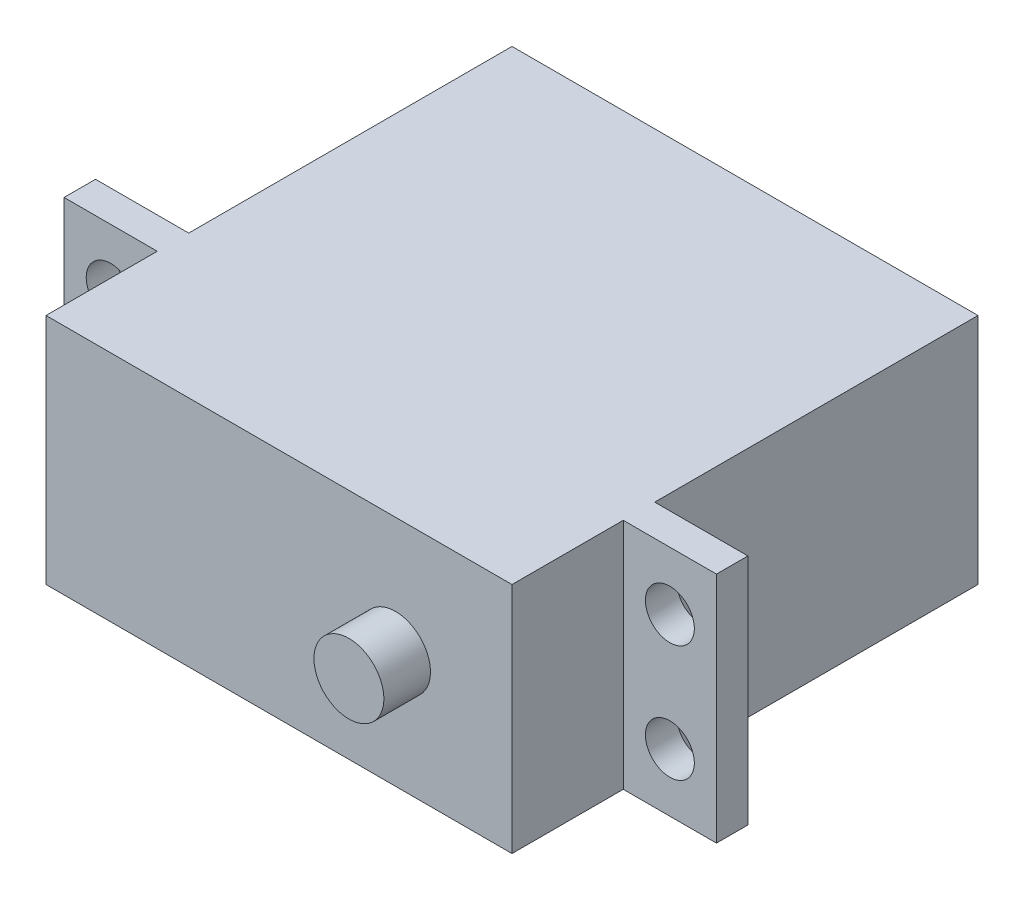
ISO-10303-21;
HEADER;
FILE_DESCRIPTION(('STEP AP214'),'2;1');
FILE_NAME('part.step','',(''),(''),'','','');
FILE_SCHEMA(('AUTOMOTIVE_DESIGN { 1 0 10303 214 1 1 1 1 }'));
ENDSEC;
DATA;
#1=APPLICATION_CONTEXT('core data for automotive mechanical design processes');
#2=APPLICATION_PROTOCOL_DEFINITION('international standard','automotive_design',2000,#1);
#3=PRODUCT_CONTEXT('',#1,'mechanical');
#4=PRODUCT('Part','Part','',(#3));
#5=PRODUCT_RELATED_PRODUCT_CATEGORY('part','',(#4));
#6=PRODUCT_DEFINITION_FORMATION('','',#4);
#7=PRODUCT_DEFINITION_CONTEXT('part definition',#1,'design');
#8=PRODUCT_DEFINITION('design','',#6,#7);
#9=PRODUCT_DEFINITION_SHAPE('','',#8);
#10=(LENGTH_UNIT() NAMED_UNIT(*) SI_UNIT(.MILLI.,.METRE.));
#11=(NAMED_UNIT(*) PLANE_ANGLE_UNIT() SI_UNIT($,.RADIAN.));
#12=(NAMED_UNIT(*) SI_UNIT($,.STERADIAN.) SOLID_ANGLE_UNIT());
#13=UNCERTAINTY_MEASURE_WITH_UNIT(LENGTH_MEASURE(1.E-05),#10,'distance_accuracy_value','');
#14=(GEOMETRIC_REPRESENTATION_CONTEXT(3) GLOBAL_UNCERTAINTY_ASSIGNED_CONTEXT((#13)) GLOBAL_UNIT_ASSIGNED_CONTEXT((#10,
#11,#12)) REPRESENTATION_CONTEXT('',''));
#15=CARTESIAN_POINT('',(0.,0.,0.));
#16=DIRECTION('',(0.,0.,1.));
#17=DIRECTION('',(1.,0.,0.));
#18=AXIS2_PLACEMENT_3D('',#15,#16,#17);
#19=CARTESIAN_POINT('',(20.,-10.,40.));
#20=DIRECTION('',(-1.,0.,0.));
#21=DIRECTION('',(0.,0.,1.));
#22=AXIS2_PLACEMENT_3D('',#19,#20,#21);
#23=PLANE('',#22);
#24=DIRECTION('',(0.,-1.,0.));
#25=VECTOR('',#24,1.);
#26=CARTESIAN_POINT('',(20.,-10.,30.45));
#27=LINE('',#26,#25);
#28=CARTESIAN_POINT('',(20.,10.,30.45));
#29=VERTEX_POINT('',#28);
#30=CARTESIAN_POINT('',(20.,-10.,30.45));
#31=VERTEX_POINT('',#30);
#32=EDGE_CURVE('E54',#29,#31,#27,.T.);
#33=ORIENTED_EDGE('',*,*,#32,.F.);
#34=DIRECTION('',(0.,0.,-1.));
#35=VECTOR('',#34,1.);
#36=CARTESIAN_POINT('',(20.,10.,40.));
#37=LINE('',#36,#35);
#38=CARTESIAN_POINT('',(20.,10.,40.));
#39=VERTEX_POINT('',#38);
#40=EDGE_CURVE('E11',#39,#29,#37,.T.);
#41=ORIENTED_EDGE('',*,*,#40,.F.);
#42=DIRECTION('',(0.,1.,0.));
#43=VECTOR('',#42,1.);
#44=CARTESIAN_POINT('',(20.,-10.,40.));
#45=LINE('',#44,#43);
#46=CARTESIAN_POINT('',(20.,-10.,40.));
#47=VERTEX_POINT('',#46);
#48=EDGE_CURVE('E168',#47,#39,#45,.T.);
#49=ORIENTED_EDGE('',*,*,#48,.F.);
#50=DIRECTION('',(0.,0.,-1.));
#51=VECTOR('',#50,1.);
#52=CARTESIAN_POINT('',(20.,-10.,40.));
#53=LINE('',#52,#51);
#54=EDGE_CURVE('E188',#47,#31,#53,.T.);
#55=ORIENTED_EDGE('',*,*,#54,.T.);
#56=EDGE_LOOP('',(#33,#41,#49,#55));
#57=FACE_BOUND('',#56,.T.);
#58=ADVANCED_FACE('F32',(#57),#23,.F.);
#59=CARTESIAN_POINT('',(-20.,-10.,40.));
#60=DIRECTION('',(1.,0.,0.));
#61=DIRECTION('',(0.,0.,-1.));
#62=AXIS2_PLACEMENT_3D('',#59,#60,#61);
#63=PLANE('',#62);
#64=DIRECTION('',(0.,1.,0.));
#65=VECTOR('',#64,1.);
#66=CARTESIAN_POINT('',(-20.,-10.,30.45));
#67=LINE('',#66,#65);
#68=CARTESIAN_POINT('',(-20.,-10.,30.45));
#69=VERTEX_POINT('',#68);
#70=CARTESIAN_POINT('',(-20.,10.,30.45));
#71=VERTEX_POINT('',#70);
#72=EDGE_CURVE('E158',#69,#71,#67,.T.);
#73=ORIENTED_EDGE('',*,*,#72,.F.);
#74=DIRECTION('',(0.,0.,-1.));
#75=VECTOR('',#74,1.);
#76=CARTESIAN_POINT('',(-20.,-10.,40.));
#77=LINE('',#76,#75);
#78=CARTESIAN_POINT('',(-20.,-10.,40.));
#79=VERTEX_POINT('',#78);
#80=EDGE_CURVE('E191',#79,#69,#77,.T.);
#81=ORIENTED_EDGE('',*,*,#80,.F.);
#82=DIRECTION('',(0.,-1.,0.));
#83=VECTOR('',#82,1.);
#84=CARTESIAN_POINT('',(-20.,-10.,40.));
#85=LINE('',#84,#83);
#86=CARTESIAN_POINT('',(-20.,10.,40.));
#87=VERTEX_POINT('',#86);
#88=EDGE_CURVE('E174',#87,#79,#85,.T.);
#89=ORIENTED_EDGE('',*,*,#88,.F.);
#90=DIRECTION('',(0.,0.,-1.));
#91=VECTOR('',#90,1.);
#92=CARTESIAN_POINT('',(-20.,10.,40.));
#93=LINE('',#92,#91);
#94=EDGE_CURVE('E194',#87,#71,#93,.T.);
#95=ORIENTED_EDGE('',*,*,#94,.T.);
#96=EDGE_LOOP('',(#73,#81,#89,#95));
#97=FACE_BOUND('',#96,.T.);
#98=ADVANCED_FACE('F278',(#97),#63,.F.);
#99=CARTESIAN_POINT('',(20.,10.,27.75));
#100=VERTEX_POINT('',#99);
#101=CARTESIAN_POINT('',(20.,10.,0.));
#102=VERTEX_POINT('',#101);
#103=EDGE_CURVE('E40',#100,#102,#37,.T.);
#104=ORIENTED_EDGE('',*,*,#103,.F.);
#105=DIRECTION('',(0.,-1.,0.));
#106=VECTOR('',#105,1.);
#107=CARTESIAN_POINT('',(20.,-10.,27.75));
#108=LINE('',#107,#106);
#109=CARTESIAN_POINT('',(20.,-10.,27.75));
#110=VERTEX_POINT('',#109);
#111=EDGE_CURVE('E150',#100,#110,#108,.T.);
#112=ORIENTED_EDGE('',*,*,#111,.T.);
#113=CARTESIAN_POINT('',(20.,-10.,0.));
#114=VERTEX_POINT('',#113);
#115=EDGE_CURVE('E178',#110,#114,#53,.T.);
#116=ORIENTED_EDGE('',*,*,#115,.T.);
#117=DIRECTION('',(0.,1.,0.));
#118=VECTOR('',#117,1.);
#119=CARTESIAN_POINT('',(20.,-10.,0.));
#120=LINE('',#119,#118);
#121=EDGE_CURVE('E165',#114,#102,#120,.T.);
#122=ORIENTED_EDGE('',*,*,#121,.T.);
#123=EDGE_LOOP('',(#104,#112,#116,#122));
#124=FACE_BOUND('',#123,.T.);
#125=ADVANCED_FACE('F34',(#124),#23,.F.);
#126=CARTESIAN_POINT('',(-20.,10.,40.));
#127=DIRECTION('',(0.,-1.,0.));
#128=DIRECTION('',(0.,0.,-1.));
#129=AXIS2_PLACEMENT_3D('',#126,#127,#128);
#130=PLANE('',#129);
#131=CARTESIAN_POINT('',(-20.,10.,27.75));
#132=VERTEX_POINT('',#131);
#133=CARTESIAN_POINT('',(-20.,10.,0.));
#134=VERTEX_POINT('',#133);
#135=EDGE_CURVE('E193',#132,#134,#93,.T.);
#136=ORIENTED_EDGE('',*,*,#135,.F.);
#137=DIRECTION('',(-1.,0.,0.));
#138=VECTOR('',#137,1.);
#139=CARTESIAN_POINT('',(-28.,10.,27.75));
#140=LINE('',#139,#138);
#141=CARTESIAN_POINT('',(-28.,10.,27.75));
#142=VERTEX_POINT('',#141);
#143=EDGE_CURVE('E221',#132,#142,#140,.T.);
#144=ORIENTED_EDGE('',*,*,#143,.T.);
#145=DIRECTION('',(0.,0.,-1.));
#146=VECTOR('',#145,1.);
#147=CARTESIAN_POINT('',(-28.,10.,30.45));
#148=LINE('',#147,#146);
#149=CARTESIAN_POINT('',(-28.,10.,30.45));
#150=VERTEX_POINT('',#149);
#151=EDGE_CURVE('E147',#150,#142,#148,.T.);
#152=ORIENTED_EDGE('',*,*,#151,.F.);
#153=DIRECTION('',(-1.,0.,0.));
#154=VECTOR('',#153,1.);
#155=CARTESIAN_POINT('',(-28.,10.,30.45));
#156=LINE('',#155,#154);
#157=EDGE_CURVE('E131',#71,#150,#156,.T.);
#158=ORIENTED_EDGE('',*,*,#157,.F.);
#159=ORIENTED_EDGE('',*,*,#94,.F.);
#160=DIRECTION('',(-1.,0.,0.));
#161=VECTOR('',#160,1.);
#162=CARTESIAN_POINT('',(-20.,10.,40.));
#163=LINE('',#162,#161);
#164=EDGE_CURVE('E171',#39,#87,#163,.T.);
#165=ORIENTED_EDGE('',*,*,#164,.F.);
#166=ORIENTED_EDGE('',*,*,#40,.T.);
#167=CARTESIAN_POINT('',(28.,10.,30.45));
#168=VERTEX_POINT('',#167);
#169=EDGE_CURVE('E121',#168,#29,#156,.T.);
#170=ORIENTED_EDGE('',*,*,#169,.F.);
#171=DIRECTION('',(0.,0.,-1.));
#172=VECTOR('',#171,1.);
#173=CARTESIAN_POINT('',(28.,10.,30.45));
#174=LINE('',#173,#172);
#175=CARTESIAN_POINT('',(28.,10.,27.75));
#176=VERTEX_POINT('',#175);
#177=EDGE_CURVE('E127',#168,#176,#174,.T.);
#178=ORIENTED_EDGE('',*,*,#177,.T.);
#179=EDGE_CURVE('E224',#176,#100,#140,.T.);
#180=ORIENTED_EDGE('',*,*,#179,.T.);
#181=ORIENTED_EDGE('',*,*,#103,.T.);
#182=DIRECTION('',(-1.,0.,0.));
#183=VECTOR('',#182,1.);
#184=CARTESIAN_POINT('',(-20.,10.,0.));
#185=LINE('',#184,#183);
#186=EDGE_CURVE('E180',#102,#134,#185,.T.);
#187=ORIENTED_EDGE('',*,*,#186,.T.);
#188=EDGE_LOOP('',(#136,#144,#152,#158,#159,#165,#166,#170,#178,#180,#181,#187));
#189=FACE_BOUND('',#188,.T.);
#190=ADVANCED_FACE('F124',(#189),#130,.F.);
#191=CARTESIAN_POINT('',(-20.,-10.,27.75));
#192=VERTEX_POINT('',#191);
#193=CARTESIAN_POINT('',(-20.,-10.,0.));
#194=VERTEX_POINT('',#193);
#195=EDGE_CURVE('E190',#192,#194,#77,.T.);
#196=ORIENTED_EDGE('',*,*,#195,.F.);
#197=DIRECTION('',(0.,1.,0.));
#198=VECTOR('',#197,1.);
#199=CARTESIAN_POINT('',(-20.,-10.,27.75));
#200=LINE('',#199,#198);
#201=EDGE_CURVE('E146',#192,#132,#200,.T.);
#202=ORIENTED_EDGE('',*,*,#201,.T.);
#203=ORIENTED_EDGE('',*,*,#135,.T.);
#204=DIRECTION('',(0.,-1.,0.));
#205=VECTOR('',#204,1.);
#206=CARTESIAN_POINT('',(-20.,-10.,0.));
#207=LINE('',#206,#205);
#208=EDGE_CURVE('E183',#134,#194,#207,.T.);
#209=ORIENTED_EDGE('',*,*,#208,.T.);
#210=EDGE_LOOP('',(#196,#202,#203,#209));
#211=FACE_BOUND('',#210,.T.);
#212=ADVANCED_FACE('F202',(#211),#63,.F.);
#213=CARTESIAN_POINT('',(-20.,-10.,40.));
#214=DIRECTION('',(0.,1.,0.));
#215=DIRECTION('',(0.,0.,1.));
#216=AXIS2_PLACEMENT_3D('',#213,#214,#215);
#217=PLANE('',#216);
#218=ORIENTED_EDGE('',*,*,#115,.F.);
#219=DIRECTION('',(1.,0.,0.));
#220=VECTOR('',#219,1.);
#221=CARTESIAN_POINT('',(-28.,-10.,27.75));
#222=LINE('',#221,#220);
#223=CARTESIAN_POINT('',(28.,-10.,27.75));
#224=VERTEX_POINT('',#223);
#225=EDGE_CURVE('E218',#110,#224,#222,.T.);
#226=ORIENTED_EDGE('',*,*,#225,.T.);
#227=DIRECTION('',(0.,0.,-1.));
#228=VECTOR('',#227,1.);
#229=CARTESIAN_POINT('',(28.,-10.,30.45));
#230=LINE('',#229,#228);
#231=CARTESIAN_POINT('',(28.,-10.,30.45));
#232=VERTEX_POINT('',#231);
#233=EDGE_CURVE('E231',#232,#224,#230,.T.);
#234=ORIENTED_EDGE('',*,*,#233,.F.);
#235=DIRECTION('',(1.,0.,0.));
#236=VECTOR('',#235,1.);
#237=CARTESIAN_POINT('',(-28.,-10.,30.45));
#238=LINE('',#237,#236);
#239=EDGE_CURVE('E137',#31,#232,#238,.T.);
#240=ORIENTED_EDGE('',*,*,#239,.F.);
#241=ORIENTED_EDGE('',*,*,#54,.F.);
#242=DIRECTION('',(1.,0.,0.));
#243=VECTOR('',#242,1.);
#244=CARTESIAN_POINT('',(-20.,-10.,40.));
#245=LINE('',#244,#243);
#246=EDGE_CURVE('E176',#79,#47,#245,.T.);
#247=ORIENTED_EDGE('',*,*,#246,.F.);
#248=ORIENTED_EDGE('',*,*,#80,.T.);
#249=CARTESIAN_POINT('',(-28.,-10.,30.45));
#250=VERTEX_POINT('',#249);
#251=EDGE_CURVE('E232',#250,#69,#238,.T.);
#252=ORIENTED_EDGE('',*,*,#251,.F.);
#253=DIRECTION('',(0.,0.,-1.));
#254=VECTOR('',#253,1.);
#255=CARTESIAN_POINT('',(-28.,-10.,30.45));
#256=LINE('',#255,#254);
#257=CARTESIAN_POINT('',(-28.,-10.,27.75));
#258=VERTEX_POINT('',#257);
#259=EDGE_CURVE('E153',#250,#258,#256,.T.);
#260=ORIENTED_EDGE('',*,*,#259,.T.);
#261=EDGE_CURVE('E141',#258,#192,#222,.T.);
#262=ORIENTED_EDGE('',*,*,#261,.T.);
#263=ORIENTED_EDGE('',*,*,#195,.T.);
#264=DIRECTION('',(1.,0.,0.));
#265=VECTOR('',#264,1.);
#266=CARTESIAN_POINT('',(-20.,-10.,0.));
#267=LINE('',#266,#265);
#268=EDGE_CURVE('E172',#194,#114,#267,.T.);
#269=ORIENTED_EDGE('',*,*,#268,.T.);
#270=EDGE_LOOP('',(#218,#226,#234,#240,#241,#247,#248,#252,#260,#262,#263,#269));
#271=FACE_BOUND('',#270,.T.);
#272=ADVANCED_FACE('F211',(#271),#217,.F.);
#273=CARTESIAN_POINT('',(0.,0.,40.));
#274=DIRECTION('',(0.,0.,-1.));
#275=DIRECTION('',(-1.,0.,0.));
#276=AXIS2_PLACEMENT_3D('',#273,#274,#275);
#277=PLANE('',#276);
#278=CARTESIAN_POINT('',(10.,0.,40.));
#279=DIRECTION('',(0.,0.,-1.));
#280=DIRECTION('',(-1.,0.,0.));
#281=AXIS2_PLACEMENT_3D('',#278,#279,#280);
#282=CIRCLE('',#281,3.);
#283=CARTESIAN_POINT('',(7.00000000000001,0.,40.));
#284=VERTEX_POINT('',#283);
#285=EDGE_CURVE('E161',#284,#284,#282,.T.);
#286=ORIENTED_EDGE('',*,*,#285,.T.);
#287=EDGE_LOOP('',(#286));
#288=FACE_BOUND('',#287,.T.);
#289=ORIENTED_EDGE('',*,*,#48,.T.);
#290=ORIENTED_EDGE('',*,*,#164,.T.);
#291=ORIENTED_EDGE('',*,*,#88,.T.);
#292=ORIENTED_EDGE('',*,*,#246,.T.);
#293=EDGE_LOOP('',(#289,#290,#291,#292));
#294=FACE_BOUND('',#293,.T.);
#295=ADVANCED_FACE('F293',(#288,#294),#277,.F.);
#296=CARTESIAN_POINT('',(0.,0.,0.));
#297=DIRECTION('',(0.,0.,-1.));
#298=DIRECTION('',(-1.,0.,0.));
#299=AXIS2_PLACEMENT_3D('',#296,#297,#298);
#300=PLANE('',#299);
#301=ORIENTED_EDGE('',*,*,#121,.F.);
#302=ORIENTED_EDGE('',*,*,#268,.F.);
#303=ORIENTED_EDGE('',*,*,#208,.F.);
#304=ORIENTED_EDGE('',*,*,#186,.F.);
#305=EDGE_LOOP('',(#301,#302,#303,#304));
#306=FACE_BOUND('',#305,.T.);
#307=ADVANCED_FACE('F209',(#306),#300,.T.);
#308=CARTESIAN_POINT('',(10.,0.,44.));
#309=DIRECTION('',(0.,0.,-1.));
#310=DIRECTION('',(-1.,0.,0.));
#311=AXIS2_PLACEMENT_3D('',#308,#309,#310);
#312=CYLINDRICAL_SURFACE('',#311,3.);
#313=CARTESIAN_POINT('',(10.,0.,44.));
#314=DIRECTION('',(0.,0.,-1.));
#315=DIRECTION('',(-1.,0.,0.));
#316=AXIS2_PLACEMENT_3D('',#313,#314,#315);
#317=CIRCLE('',#316,3.);
#318=CARTESIAN_POINT('',(7.00000000000001,0.,44.));
#319=VERTEX_POINT('',#318);
#320=EDGE_CURVE('E162',#319,#319,#317,.T.);
#321=ORIENTED_EDGE('',*,*,#320,.T.);
#322=EDGE_LOOP('',(#321));
#323=FACE_BOUND('',#322,.T.);
#324=ORIENTED_EDGE('',*,*,#285,.F.);
#325=EDGE_LOOP('',(#324));
#326=FACE_BOUND('',#325,.T.);
#327=ADVANCED_FACE('F296',(#323,#326),#312,.T.);
#328=CARTESIAN_POINT('',(10.,0.,44.));
#329=DIRECTION('',(0.,0.,-1.));
#330=DIRECTION('',(-1.,0.,0.));
#331=AXIS2_PLACEMENT_3D('',#328,#329,#330);
#332=PLANE('',#331);
#333=ORIENTED_EDGE('',*,*,#320,.F.);
#334=EDGE_LOOP('',(#333));
#335=FACE_BOUND('',#334,.T.);
#336=ADVANCED_FACE('F302',(#335),#332,.F.);
#337=CARTESIAN_POINT('',(-24.,5.,30.45));
#338=DIRECTION('',(0.,0.,-1.));
#339=DIRECTION('',(-1.,0.,0.));
#340=AXIS2_PLACEMENT_3D('',#337,#338,#339);
#341=CYLINDRICAL_SURFACE('',#340,2.1);
#342=CARTESIAN_POINT('',(-24.,5.,30.45));
#343=DIRECTION('',(0.,0.,1.));
#344=DIRECTION('',(1.,0.,0.));
#345=AXIS2_PLACEMENT_3D('',#342,#343,#344);
#346=CIRCLE('',#345,2.1);
#347=CARTESIAN_POINT('',(-26.1,5.,30.45));
#348=VERTEX_POINT('',#347);
#349=EDGE_CURVE('E226',#348,#348,#346,.T.);
#350=CARTESIAN_POINT('',(-24.,5.,27.75));
#351=DIRECTION('',(0.,0.,1.));
#352=DIRECTION('',(1.,0.,0.));
#353=AXIS2_PLACEMENT_3D('',#350,#351,#352);
#354=CIRCLE('',#353,2.1);
#355=CARTESIAN_POINT('',(-26.1,5.,27.75));
#356=VERTEX_POINT('',#355);
#357=EDGE_CURVE('E236',#356,#356,#354,.T.);
#358=CARTESIAN_POINT('',(-26.1,5.,30.45));
#359=CARTESIAN_POINT('',(-26.1,5.,30.421875));
#360=CARTESIAN_POINT('',(-26.1,5.,30.39375));
#361=CARTESIAN_POINT('',(-26.1,5.,30.3375));
#362=CARTESIAN_POINT('',(-26.1,5.,30.309375));
#363=CARTESIAN_POINT('',(-26.1,5.,30.253125));
#364=CARTESIAN_POINT('',(-26.1,5.,30.225));
#365=CARTESIAN_POINT('',(-26.1,5.,30.16875));
#366=CARTESIAN_POINT('',(-26.1,5.,30.140625));
#367=CARTESIAN_POINT('',(-26.1,5.,30.084375));
#368=CARTESIAN_POINT('',(-26.1,5.,30.05625));
#369=CARTESIAN_POINT('',(-26.1,5.,30.));
#370=CARTESIAN_POINT('',(-26.1,5.,29.971875));
#371=CARTESIAN_POINT('',(-26.1,5.,29.915625));
#372=CARTESIAN_POINT('',(-26.1,5.,29.8875));
#373=CARTESIAN_POINT('',(-26.1,5.,29.83125));
#374=CARTESIAN_POINT('',(-26.1,5.,29.803125));
#375=CARTESIAN_POINT('',(-26.1,5.,29.746875));
#376=CARTESIAN_POINT('',(-26.1,5.,29.71875));
#377=CARTESIAN_POINT('',(-26.1,5.,29.6625));
#378=CARTESIAN_POINT('',(-26.1,5.,29.634375));
#379=CARTESIAN_POINT('',(-26.1,5.,29.578125));
#380=CARTESIAN_POINT('',(-26.1,5.,29.55));
#381=CARTESIAN_POINT('',(-26.1,5.,29.49375));
#382=CARTESIAN_POINT('',(-26.1,5.,29.465625));
#383=CARTESIAN_POINT('',(-26.1,5.,29.409375));
#384=CARTESIAN_POINT('',(-26.1,5.,29.38125));
#385=CARTESIAN_POINT('',(-26.1,5.,29.325));
#386=CARTESIAN_POINT('',(-26.1,5.,29.296875));
#387=CARTESIAN_POINT('',(-26.1,5.,29.240625));
#388=CARTESIAN_POINT('',(-26.1,5.,29.2125));
#389=CARTESIAN_POINT('',(-26.1,5.,29.15625));
#390=CARTESIAN_POINT('',(-26.1,5.,29.128125));
#391=CARTESIAN_POINT('',(-26.1,5.,29.071875));
#392=CARTESIAN_POINT('',(-26.1,5.,29.04375));
#393=CARTESIAN_POINT('',(-26.1,5.,28.9875));
#394=CARTESIAN_POINT('',(-26.1,5.,28.959375));
#395=CARTESIAN_POINT('',(-26.1,5.,28.903125));
#396=CARTESIAN_POINT('',(-26.1,5.,28.875));
#397=CARTESIAN_POINT('',(-26.1,5.,28.81875));
#398=CARTESIAN_POINT('',(-26.1,5.,28.790625));
#399=CARTESIAN_POINT('',(-26.1,5.,28.734375));
#400=CARTESIAN_POINT('',(-26.1,5.,28.70625));
#401=CARTESIAN_POINT('',(-26.1,5.,28.65));
#402=CARTESIAN_POINT('',(-26.1,5.,28.621875));
#403=CARTESIAN_POINT('',(-26.1,5.,28.565625));
#404=CARTESIAN_POINT('',(-26.1,5.,28.5375));
#405=CARTESIAN_POINT('',(-26.1,5.,28.48125));
#406=CARTESIAN_POINT('',(-26.1,5.,28.453125));
#407=CARTESIAN_POINT('',(-26.1,5.,28.396875));
#408=CARTESIAN_POINT('',(-26.1,5.,28.36875));
#409=CARTESIAN_POINT('',(-26.1,5.,28.3125));
#410=CARTESIAN_POINT('',(-26.1,5.,28.284375));
#411=CARTESIAN_POINT('',(-26.1,5.,28.228125));
#412=CARTESIAN_POINT('',(-26.1,5.,28.2));
#413=CARTESIAN_POINT('',(-26.1,5.,28.14375));
#414=CARTESIAN_POINT('',(-26.1,5.,28.115625));
#415=CARTESIAN_POINT('',(-26.1,5.,28.059375));
#416=CARTESIAN_POINT('',(-26.1,5.,28.03125));
#417=CARTESIAN_POINT('',(-26.1,5.,27.975));
#418=CARTESIAN_POINT('',(-26.1,5.,27.946875));
#419=CARTESIAN_POINT('',(-26.1,5.,27.890625));
#420=CARTESIAN_POINT('',(-26.1,5.,27.8625));
#421=CARTESIAN_POINT('',(-26.1,5.,27.80625));
#422=CARTESIAN_POINT('',(-26.1,5.,27.778125));
#423=CARTESIAN_POINT('',(-26.1,5.,27.75));
#424=B_SPLINE_CURVE_WITH_KNOTS('',3,(#358,#359,#360,#361,#362,#363,#364,#365,#366,#367,#368,
#369,#370,#371,#372,#373,#374,#375,#376,#377,#378,#379,#380,#381,#382,#383,#384,#385,#386,#387,
#388,#389,#390,#391,#392,#393,#394,#395,#396,#397,#398,#399,#400,#401,#402,#403,#404,#405,#406,
#407,#408,#409,#410,#411,#412,#413,#414,#415,#416,#417,#418,#419,#420,#421,#422,#423),
.UNSPECIFIED.,.F.,.F.,(4,2,2,2,2,2,2,2,2,2,2,2,2,2,2,2,2,2,2,2,2,2,2,2,2,2,2,2,2,2,2,2,4),(0.,
0.0843749999999976,0.168749999999999,0.253125,0.337499999999998,0.421874999999999,0.50625,
0.590624999999997,0.674999999999998,0.759375,0.843749999999997,0.928124999999998,1.0125,
1.096875,1.18125,1.265625,1.35,1.434375,1.51875,1.603125,1.6875,1.771875,1.85625,1.940625,2.025,
2.109375,2.19375,2.278125,2.3625,2.446875,2.53125,2.615625,2.7),.UNSPECIFIED.);
#425=EDGE_CURVE('BSEAM306',#348,#356,#424,.T.);
#426=ORIENTED_EDGE('',*,*,#349,.T.);
#427=ORIENTED_EDGE('',*,*,#357,.F.);
#428=ORIENTED_EDGE('',*,*,#425,.T.);
#429=ORIENTED_EDGE('',*,*,#425,.F.);
#430=EDGE_LOOP('',(#426,#428,#427,#429));
#431=FACE_BOUND('',#430,.T.);
#432=ADVANCED_FACE('F306',(#431),#341,.F.);
#433=CARTESIAN_POINT('',(-24.,-5.,30.45));
#434=DIRECTION('',(0.,0.,-1.));
#435=DIRECTION('',(-1.,0.,0.));
#436=AXIS2_PLACEMENT_3D('',#433,#434,#435);
#437=CYLINDRICAL_SURFACE('',#436,2.1);
#438=CARTESIAN_POINT('',(-24.,-5.,30.45));
#439=DIRECTION('',(0.,0.,1.));
#440=DIRECTION('',(-1.,0.,0.));
#441=AXIS2_PLACEMENT_3D('',#438,#439,#440);
#442=CIRCLE('',#441,2.1);
#443=CARTESIAN_POINT('',(-26.1,-5.,30.45));
#444=VERTEX_POINT('',#443);
#445=EDGE_CURVE('E239',#444,#444,#442,.T.);
#446=CARTESIAN_POINT('',(-24.,-5.,27.75));
#447=DIRECTION('',(0.,0.,1.));
#448=DIRECTION('',(-1.,0.,0.));
#449=AXIS2_PLACEMENT_3D('',#446,#447,#448);
#450=CIRCLE('',#449,2.1);
#451=CARTESIAN_POINT('',(-26.1,-5.,27.75));
#452=VERTEX_POINT('',#451);
#453=EDGE_CURVE('E242',#452,#452,#450,.T.);
#454=CARTESIAN_POINT('',(-26.1,-5.,30.45));
#455=CARTESIAN_POINT('',(-26.1,-5.,30.421875));
#456=CARTESIAN_POINT('',(-26.1,-5.,30.39375));
#457=CARTESIAN_POINT('',(-26.1,-5.,30.3375));
#458=CARTESIAN_POINT('',(-26.1,-5.,30.309375));
#459=CARTESIAN_POINT('',(-26.1,-5.,30.253125));
#460=CARTESIAN_POINT('',(-26.1,-5.,30.225));
#461=CARTESIAN_POINT('',(-26.1,-5.,30.16875));
#462=CARTESIAN_POINT('',(-26.1,-5.,30.140625));
#463=CARTESIAN_POINT('',(-26.1,-5.,30.084375));
#464=CARTESIAN_POINT('',(-26.1,-5.,30.05625));
#465=CARTESIAN_POINT('',(-26.1,-5.,30.));
#466=CARTESIAN_POINT('',(-26.1,-5.,29.971875));
#467=CARTESIAN_POINT('',(-26.1,-5.,29.915625));
#468=CARTESIAN_POINT('',(-26.1,-5.,29.8875));
#469=CARTESIAN_POINT('',(-26.1,-5.,29.83125));
#470=CARTESIAN_POINT('',(-26.1,-5.,29.803125));
#471=CARTESIAN_POINT('',(-26.1,-5.,29.746875));
#472=CARTESIAN_POINT('',(-26.1,-5.,29.71875));
#473=CARTESIAN_POINT('',(-26.1,-5.,29.6625));
#474=CARTESIAN_POINT('',(-26.1,-5.,29.634375));
#475=CARTESIAN_POINT('',(-26.1,-5.,29.578125));
#476=CARTESIAN_POINT('',(-26.1,-5.,29.55));
#477=CARTESIAN_POINT('',(-26.1,-5.,29.49375));
#478=CARTESIAN_POINT('',(-26.1,-5.,29.465625));
#479=CARTESIAN_POINT('',(-26.1,-5.,29.409375));
#480=CARTESIAN_POINT('',(-26.1,-5.,29.38125));
#481=CARTESIAN_POINT('',(-26.1,-5.,29.325));
#482=CARTESIAN_POINT('',(-26.1,-5.,29.296875));
#483=CARTESIAN_POINT('',(-26.1,-5.,29.240625));
#484=CARTESIAN_POINT('',(-26.1,-5.,29.2125));
#485=CARTESIAN_POINT('',(-26.1,-5.,29.15625));
#486=CARTESIAN_POINT('',(-26.1,-5.,29.128125));
#487=CARTESIAN_POINT('',(-26.1,-5.,29.071875));
#488=CARTESIAN_POINT('',(-26.1,-5.,29.04375));
#489=CARTESIAN_POINT('',(-26.1,-5.,28.9875));
#490=CARTESIAN_POINT('',(-26.1,-5.,28.959375));
#491=CARTESIAN_POINT('',(-26.1,-5.,28.903125));
#492=CARTESIAN_POINT('',(-26.1,-5.,28.875));
#493=CARTESIAN_POINT('',(-26.1,-5.,28.81875));
#494=CARTESIAN_POINT('',(-26.1,-5.,28.790625));
#495=CARTESIAN_POINT('',(-26.1,-5.,28.734375));
#496=CARTESIAN_POINT('',(-26.1,-5.,28.70625));
#497=CARTESIAN_POINT('',(-26.1,-5.,28.65));
#498=CARTESIAN_POINT('',(-26.1,-5.,28.621875));
#499=CARTESIAN_POINT('',(-26.1,-5.,28.565625));
#500=CARTESIAN_POINT('',(-26.1,-5.,28.5375));
#501=CARTESIAN_POINT('',(-26.1,-5.,28.48125));
#502=CARTESIAN_POINT('',(-26.1,-5.,28.453125));
#503=CARTESIAN_POINT('',(-26.1,-5.,28.396875));
#504=CARTESIAN_POINT('',(-26.1,-5.,28.36875));
#505=CARTESIAN_POINT('',(-26.1,-5.,28.3125));
#506=CARTESIAN_POINT('',(-26.1,-5.,28.284375));
#507=CARTESIAN_POINT('',(-26.1,-5.,28.228125));
#508=CARTESIAN_POINT('',(-26.1,-5.,28.2));
#509=CARTESIAN_POINT('',(-26.1,-5.,28.14375));
#510=CARTESIAN_POINT('',(-26.1,-5.,28.115625));
#511=CARTESIAN_POINT('',(-26.1,-5.,28.059375));
#512=CARTESIAN_POINT('',(-26.1,-5.,28.03125));
#513=CARTESIAN_POINT('',(-26.1,-5.,27.975));
#514=CARTESIAN_POINT('',(-26.1,-5.,27.946875));
#515=CARTESIAN_POINT('',(-26.1,-5.,27.890625));
#516=CARTESIAN_POINT('',(-26.1,-5.,27.8625));
#517=CARTESIAN_POINT('',(-26.1,-5.,27.80625));
#518=CARTESIAN_POINT('',(-26.1,-5.,27.778125));
#519=CARTESIAN_POINT('',(-26.1,-5.,27.75));
#520=B_SPLINE_CURVE_WITH_KNOTS('',3,(#454,#455,#456,#457,#458,#459,#460,#461,#462,#463,#464,
#465,#466,#467,#468,#469,#470,#471,#472,#473,#474,#475,#476,#477,#478,#479,#480,#481,#482,#483,
#484,#485,#486,#487,#488,#489,#490,#491,#492,#493,#494,#495,#496,#497,#498,#499,#500,#501,#502,
#503,#504,#505,#506,#507,#508,#509,#510,#511,#512,#513,#514,#515,#516,#517,#518,#519),
.UNSPECIFIED.,.F.,.F.,(4,2,2,2,2,2,2,2,2,2,2,2,2,2,2,2,2,2,2,2,2,2,2,2,2,2,2,2,2,2,2,2,4),(0.,
0.0843749999999976,0.168749999999999,0.253125,0.337499999999998,0.421874999999999,0.50625,
0.590624999999997,0.674999999999998,0.759375,0.843749999999997,0.928124999999998,1.0125,
1.096875,1.18125,1.265625,1.35,1.434375,1.51875,1.603125,1.6875,1.771875,1.85625,1.940625,2.025,
2.109375,2.19375,2.278125,2.3625,2.446875,2.53125,2.615625,2.7),.UNSPECIFIED.);
#521=EDGE_CURVE('BSEAM313',#444,#452,#520,.T.);
#522=ORIENTED_EDGE('',*,*,#445,.T.);
#523=ORIENTED_EDGE('',*,*,#453,.F.);
#524=ORIENTED_EDGE('',*,*,#521,.T.);
#525=ORIENTED_EDGE('',*,*,#521,.F.);
#526=EDGE_LOOP('',(#522,#524,#523,#525));
#527=FACE_BOUND('',#526,.T.);
#528=ADVANCED_FACE('F313',(#527),#437,.F.);
#529=CARTESIAN_POINT('',(-28.,-10.,30.45));
#530=DIRECTION('',(1.,0.,0.));
#531=DIRECTION('',(0.,0.,-1.));
#532=AXIS2_PLACEMENT_3D('',#529,#530,#531);
#533=PLANE('',#532);
#534=DIRECTION('',(0.,-1.,0.));
#535=VECTOR('',#534,1.);
#536=CARTESIAN_POINT('',(-28.,-10.,27.75));
#537=LINE('',#536,#535);
#538=EDGE_CURVE('E222',#142,#258,#537,.T.);
#539=ORIENTED_EDGE('',*,*,#538,.T.);
#540=ORIENTED_EDGE('',*,*,#259,.F.);
#541=DIRECTION('',(0.,-1.,0.));
#542=VECTOR('',#541,1.);
#543=CARTESIAN_POINT('',(-28.,-10.,30.45));
#544=LINE('',#543,#542);
#545=EDGE_CURVE('E130',#150,#250,#544,.T.);
#546=ORIENTED_EDGE('',*,*,#545,.F.);
#547=ORIENTED_EDGE('',*,*,#151,.T.);
#548=EDGE_LOOP('',(#539,#540,#546,#547));
#549=FACE_BOUND('',#548,.T.);
#550=ADVANCED_FACE('F311',(#549),#533,.F.);
#551=CARTESIAN_POINT('',(0.,0.,27.75));
#552=DIRECTION('',(0.,0.,-1.));
#553=DIRECTION('',(-1.,0.,0.));
#554=AXIS2_PLACEMENT_3D('',#551,#552,#553);
#555=PLANE('',#554);
#556=ORIENTED_EDGE('',*,*,#453,.T.);
#557=EDGE_LOOP('',(#556));
#558=FACE_BOUND('',#557,.T.);
#559=ORIENTED_EDGE('',*,*,#357,.T.);
#560=EDGE_LOOP('',(#559));
#561=FACE_BOUND('',#560,.T.);
#562=ORIENTED_EDGE('',*,*,#201,.F.);
#563=ORIENTED_EDGE('',*,*,#261,.F.);
#564=ORIENTED_EDGE('',*,*,#538,.F.);
#565=ORIENTED_EDGE('',*,*,#143,.F.);
#566=EDGE_LOOP('',(#562,#563,#564,#565));
#567=FACE_BOUND('',#566,.T.);
#568=ADVANCED_FACE('F220',(#558,#561,#567),#555,.T.);
#569=CARTESIAN_POINT('',(0.,0.,30.45));
#570=DIRECTION('',(0.,0.,-1.));
#571=DIRECTION('',(-1.,0.,0.));
#572=AXIS2_PLACEMENT_3D('',#569,#570,#571);
#573=PLANE('',#572);
#574=ORIENTED_EDGE('',*,*,#445,.F.);
#575=EDGE_LOOP('',(#574));
#576=FACE_BOUND('',#575,.T.);
#577=ORIENTED_EDGE('',*,*,#349,.F.);
#578=EDGE_LOOP('',(#577));
#579=FACE_BOUND('',#578,.T.);
#580=ORIENTED_EDGE('',*,*,#251,.T.);
#581=ORIENTED_EDGE('',*,*,#72,.T.);
#582=ORIENTED_EDGE('',*,*,#157,.T.);
#583=ORIENTED_EDGE('',*,*,#545,.T.);
#584=EDGE_LOOP('',(#580,#581,#582,#583));
#585=FACE_BOUND('',#584,.T.);
#586=ADVANCED_FACE('F265',(#576,#579,#585),#573,.F.);
#587=CARTESIAN_POINT('',(24.,-5.,30.45));
#588=DIRECTION('',(0.,0.,1.));
#589=DIRECTION('',(1.,0.,0.));
#590=AXIS2_PLACEMENT_3D('',#587,#588,#589);
#591=CIRCLE('',#590,2.1);
#592=CARTESIAN_POINT('',(21.9,-5.,30.45));
#593=VERTEX_POINT('',#592);
#594=EDGE_CURVE('E245',#593,#593,#591,.T.);
#595=ORIENTED_EDGE('',*,*,#594,.F.);
#596=EDGE_LOOP('',(#595));
#597=FACE_BOUND('',#596,.T.);
#598=CARTESIAN_POINT('',(24.,5.,30.45));
#599=DIRECTION('',(0.,0.,1.));
#600=DIRECTION('',(-1.,0.,0.));
#601=AXIS2_PLACEMENT_3D('',#598,#599,#600);
#602=CIRCLE('',#601,2.1);
#603=CARTESIAN_POINT('',(21.9,5.,30.45));
#604=VERTEX_POINT('',#603);
#605=EDGE_CURVE('E251',#604,#604,#602,.T.);
#606=ORIENTED_EDGE('',*,*,#605,.F.);
#607=EDGE_LOOP('',(#606));
#608=FACE_BOUND('',#607,.T.);
#609=ORIENTED_EDGE('',*,*,#169,.T.);
#610=ORIENTED_EDGE('',*,*,#32,.T.);
#611=ORIENTED_EDGE('',*,*,#239,.T.);
#612=DIRECTION('',(0.,1.,0.));
#613=VECTOR('',#612,1.);
#614=CARTESIAN_POINT('',(28.,-10.,30.45));
#615=LINE('',#614,#613);
#616=EDGE_CURVE('E134',#232,#168,#615,.T.);
#617=ORIENTED_EDGE('',*,*,#616,.T.);
#618=EDGE_LOOP('',(#609,#610,#611,#617));
#619=FACE_BOUND('',#618,.T.);
#620=ADVANCED_FACE('F135',(#597,#608,#619),#573,.F.);
#621=CARTESIAN_POINT('',(24.,5.,27.75));
#622=DIRECTION('',(0.,0.,1.));
#623=DIRECTION('',(-1.,0.,0.));
#624=AXIS2_PLACEMENT_3D('',#621,#622,#623);
#625=CIRCLE('',#624,2.1);
#626=CARTESIAN_POINT('',(21.9,5.,27.75));
#627=VERTEX_POINT('',#626);
#628=EDGE_CURVE('E254',#627,#627,#625,.T.);
#629=ORIENTED_EDGE('',*,*,#628,.T.);
#630=EDGE_LOOP('',(#629));
#631=FACE_BOUND('',#630,.T.);
#632=CARTESIAN_POINT('',(24.,-5.,27.75));
#633=DIRECTION('',(0.,0.,1.));
#634=DIRECTION('',(1.,0.,0.));
#635=AXIS2_PLACEMENT_3D('',#632,#633,#634);
#636=CIRCLE('',#635,2.1);
#637=CARTESIAN_POINT('',(21.9,-5.,27.75));
#638=VERTEX_POINT('',#637);
#639=EDGE_CURVE('E248',#638,#638,#636,.T.);
#640=ORIENTED_EDGE('',*,*,#639,.T.);
#641=EDGE_LOOP('',(#640));
#642=FACE_BOUND('',#641,.T.);
#643=ORIENTED_EDGE('',*,*,#111,.F.);
#644=ORIENTED_EDGE('',*,*,#179,.F.);
#645=DIRECTION('',(0.,1.,0.));
#646=VECTOR('',#645,1.);
#647=CARTESIAN_POINT('',(28.,-10.,27.75));
#648=LINE('',#647,#646);
#649=EDGE_CURVE('E145',#224,#176,#648,.T.);
#650=ORIENTED_EDGE('',*,*,#649,.F.);
#651=ORIENTED_EDGE('',*,*,#225,.F.);
#652=EDGE_LOOP('',(#643,#644,#650,#651));
#653=FACE_BOUND('',#652,.T.);
#654=ADVANCED_FACE('F264',(#631,#642,#653),#555,.T.);
#655=CARTESIAN_POINT('',(28.,-10.,30.45));
#656=DIRECTION('',(-1.,0.,0.));
#657=DIRECTION('',(0.,0.,1.));
#658=AXIS2_PLACEMENT_3D('',#655,#656,#657);
#659=PLANE('',#658);
#660=ORIENTED_EDGE('',*,*,#649,.T.);
#661=ORIENTED_EDGE('',*,*,#177,.F.);
#662=ORIENTED_EDGE('',*,*,#616,.F.);
#663=ORIENTED_EDGE('',*,*,#233,.T.);
#664=EDGE_LOOP('',(#660,#661,#662,#663));
#665=FACE_BOUND('',#664,.T.);
#666=ADVANCED_FACE('F143',(#665),#659,.F.);
#667=CARTESIAN_POINT('',(24.,-5.,30.45));
#668=DIRECTION('',(0.,0.,-1.));
#669=DIRECTION('',(-1.,0.,0.));
#670=AXIS2_PLACEMENT_3D('',#667,#668,#669);
#671=CYLINDRICAL_SURFACE('',#670,2.1);
#672=CARTESIAN_POINT('',(21.9,-5.,30.45));
#673=CARTESIAN_POINT('',(21.9,-5.,30.421875));
#674=CARTESIAN_POINT('',(21.9,-5.,30.39375));
#675=CARTESIAN_POINT('',(21.9,-5.,30.3375));
#676=CARTESIAN_POINT('',(21.9,-5.,30.309375));
#677=CARTESIAN_POINT('',(21.9,-5.,30.253125));
#678=CARTESIAN_POINT('',(21.9,-5.,30.225));
#679=CARTESIAN_POINT('',(21.9,-5.,30.16875));
#680=CARTESIAN_POINT('',(21.9,-5.,30.140625));
#681=CARTESIAN_POINT('',(21.9,-5.,30.084375));
#682=CARTESIAN_POINT('',(21.9,-5.,30.05625));
#683=CARTESIAN_POINT('',(21.9,-5.,30.));
#684=CARTESIAN_POINT('',(21.9,-5.,29.971875));
#685=CARTESIAN_POINT('',(21.9,-5.,29.915625));
#686=CARTESIAN_POINT('',(21.9,-5.,29.8875));
#687=CARTESIAN_POINT('',(21.9,-5.,29.83125));
#688=CARTESIAN_POINT('',(21.9,-5.,29.803125));
#689=CARTESIAN_POINT('',(21.9,-5.,29.746875));
#690=CARTESIAN_POINT('',(21.9,-5.,29.71875));
#691=CARTESIAN_POINT('',(21.9,-5.,29.6625));
#692=CARTESIAN_POINT('',(21.9,-5.,29.634375));
#693=CARTESIAN_POINT('',(21.9,-5.,29.578125));
#694=CARTESIAN_POINT('',(21.9,-5.,29.55));
#695=CARTESIAN_POINT('',(21.9,-5.,29.49375));
#696=CARTESIAN_POINT('',(21.9,-5.,29.465625));
#697=CARTESIAN_POINT('',(21.9,-5.,29.409375));
#698=CARTESIAN_POINT('',(21.9,-5.,29.38125));
#699=CARTESIAN_POINT('',(21.9,-5.,29.325));
#700=CARTESIAN_POINT('',(21.9,-5.,29.296875));
#701=CARTESIAN_POINT('',(21.9,-5.,29.240625));
#702=CARTESIAN_POINT('',(21.9,-5.,29.2125));
#703=CARTESIAN_POINT('',(21.9,-5.,29.15625));
#704=CARTESIAN_POINT('',(21.9,-5.,29.128125));
#705=CARTESIAN_POINT('',(21.9,-5.,29.071875));
#706=CARTESIAN_POINT('',(21.9,-5.,29.04375));
#707=CARTESIAN_POINT('',(21.9,-5.,28.9875));
#708=CARTESIAN_POINT('',(21.9,-5.,28.959375));
#709=CARTESIAN_POINT('',(21.9,-5.,28.903125));
#710=CARTESIAN_POINT('',(21.9,-5.,28.875));
#711=CARTESIAN_POINT('',(21.9,-5.,28.81875));
#712=CARTESIAN_POINT('',(21.9,-5.,28.790625));
#713=CARTESIAN_POINT('',(21.9,-5.,28.734375));
#714=CARTESIAN_POINT('',(21.9,-5.,28.70625));
#715=CARTESIAN_POINT('',(21.9,-5.,28.65));
#716=CARTESIAN_POINT('',(21.9,-5.,28.621875));
#717=CARTESIAN_POINT('',(21.9,-5.,28.565625));
#718=CARTESIAN_POINT('',(21.9,-5.,28.5375));
#719=CARTESIAN_POINT('',(21.9,-5.,28.48125));
#720=CARTESIAN_POINT('',(21.9,-5.,28.453125));
#721=CARTESIAN_POINT('',(21.9,-5.,28.396875));
#722=CARTESIAN_POINT('',(21.9,-5.,28.36875));
#723=CARTESIAN_POINT('',(21.9,-5.,28.3125));
#724=CARTESIAN_POINT('',(21.9,-5.,28.284375));
#725=CARTESIAN_POINT('',(21.9,-5.,28.228125));
#726=CARTESIAN_POINT('',(21.9,-5.,28.2));
#727=CARTESIAN_POINT('',(21.9,-5.,28.14375));
#728=CARTESIAN_POINT('',(21.9,-5.,28.115625));
#729=CARTESIAN_POINT('',(21.9,-5.,28.059375));
#730=CARTESIAN_POINT('',(21.9,-5.,28.03125));
#731=CARTESIAN_POINT('',(21.9,-5.,27.975));
#732=CARTESIAN_POINT('',(21.9,-5.,27.946875));
#733=CARTESIAN_POINT('',(21.9,-5.,27.890625));
#734=CARTESIAN_POINT('',(21.9,-5.,27.8625));
#735=CARTESIAN_POINT('',(21.9,-5.,27.80625));
#736=CARTESIAN_POINT('',(21.9,-5.,27.778125));
#737=CARTESIAN_POINT('',(21.9,-5.,27.75));
#738=B_SPLINE_CURVE_WITH_KNOTS('',3,(#672,#673,#674,#675,#676,#677,#678,#679,#680,#681,#682,
#683,#684,#685,#686,#687,#688,#689,#690,#691,#692,#693,#694,#695,#696,#697,#698,#699,#700,#701,
#702,#703,#704,#705,#706,#707,#708,#709,#710,#711,#712,#713,#714,#715,#716,#717,#718,#719,#720,
#721,#722,#723,#724,#725,#726,#727,#728,#729,#730,#731,#732,#733,#734,#735,#736,#737),
.UNSPECIFIED.,.F.,.F.,(4,2,2,2,2,2,2,2,2,2,2,2,2,2,2,2,2,2,2,2,2,2,2,2,2,2,2,2,2,2,2,2,4),(0.,
0.0843749999999976,0.168749999999999,0.253125,0.337499999999998,0.421874999999999,0.50625,
0.590624999999997,0.674999999999998,0.759375,0.843749999999997,0.928124999999998,1.0125,
1.096875,1.18125,1.265625,1.35,1.434375,1.51875,1.603125,1.6875,1.771875,1.85625,1.940625,2.025,
2.109375,2.19375,2.278125,2.3625,2.446875,2.53125,2.615625,2.7),.UNSPECIFIED.);
#739=EDGE_CURVE('BSEAM310',#593,#638,#738,.T.);
#740=ORIENTED_EDGE('',*,*,#594,.T.);
#741=ORIENTED_EDGE('',*,*,#639,.F.);
#742=ORIENTED_EDGE('',*,*,#739,.T.);
#743=ORIENTED_EDGE('',*,*,#739,.F.);
#744=EDGE_LOOP('',(#740,#742,#741,#743));
#745=FACE_BOUND('',#744,.T.);
#746=ADVANCED_FACE('F310',(#745),#671,.F.);
#747=CARTESIAN_POINT('',(24.,5.,30.45));
#748=DIRECTION('',(0.,0.,-1.));
#749=DIRECTION('',(-1.,0.,0.));
#750=AXIS2_PLACEMENT_3D('',#747,#748,#749);
#751=CYLINDRICAL_SURFACE('',#750,2.1);
#752=CARTESIAN_POINT('',(21.9,5.,30.45));
#753=CARTESIAN_POINT('',(21.9,5.,30.421875));
#754=CARTESIAN_POINT('',(21.9,5.,30.39375));
#755=CARTESIAN_POINT('',(21.9,5.,30.3375));
#756=CARTESIAN_POINT('',(21.9,5.,30.309375));
#757=CARTESIAN_POINT('',(21.9,5.,30.253125));
#758=CARTESIAN_POINT('',(21.9,5.,30.225));
#759=CARTESIAN_POINT('',(21.9,5.,30.16875));
#760=CARTESIAN_POINT('',(21.9,5.,30.140625));
#761=CARTESIAN_POINT('',(21.9,5.,30.084375));
#762=CARTESIAN_POINT('',(21.9,5.,30.05625));
#763=CARTESIAN_POINT('',(21.9,5.,30.));
#764=CARTESIAN_POINT('',(21.9,5.,29.971875));
#765=CARTESIAN_POINT('',(21.9,5.,29.915625));
#766=CARTESIAN_POINT('',(21.9,5.,29.8875));
#767=CARTESIAN_POINT('',(21.9,5.,29.83125));
#768=CARTESIAN_POINT('',(21.9,5.,29.803125));
#769=CARTESIAN_POINT('',(21.9,5.,29.746875));
#770=CARTESIAN_POINT('',(21.9,5.,29.71875));
#771=CARTESIAN_POINT('',(21.9,5.,29.6625));
#772=CARTESIAN_POINT('',(21.9,5.,29.634375));
#773=CARTESIAN_POINT('',(21.9,5.,29.578125));
#774=CARTESIAN_POINT('',(21.9,5.,29.55));
#775=CARTESIAN_POINT('',(21.9,5.,29.49375));
#776=CARTESIAN_POINT('',(21.9,5.,29.465625));
#777=CARTESIAN_POINT('',(21.9,5.,29.409375));
#778=CARTESIAN_POINT('',(21.9,5.,29.38125));
#779=CARTESIAN_POINT('',(21.9,5.,29.325));
#780=CARTESIAN_POINT('',(21.9,5.,29.296875));
#781=CARTESIAN_POINT('',(21.9,5.,29.240625));
#782=CARTESIAN_POINT('',(21.9,5.,29.2125));
#783=CARTESIAN_POINT('',(21.9,5.,29.15625));
#784=CARTESIAN_POINT('',(21.9,5.,29.128125));
#785=CARTESIAN_POINT('',(21.9,5.,29.071875));
#786=CARTESIAN_POINT('',(21.9,5.,29.04375));
#787=CARTESIAN_POINT('',(21.9,5.,28.9875));
#788=CARTESIAN_POINT('',(21.9,5.,28.959375));
#789=CARTESIAN_POINT('',(21.9,5.,28.903125));
#790=CARTESIAN_POINT('',(21.9,5.,28.875));
#791=CARTESIAN_POINT('',(21.9,5.,28.81875));
#792=CARTESIAN_POINT('',(21.9,5.,28.790625));
#793=CARTESIAN_POINT('',(21.9,5.,28.734375));
#794=CARTESIAN_POINT('',(21.9,5.,28.70625));
#795=CARTESIAN_POINT('',(21.9,5.,28.65));
#796=CARTESIAN_POINT('',(21.9,5.,28.621875));
#797=CARTESIAN_POINT('',(21.9,5.,28.565625));
#798=CARTESIAN_POINT('',(21.9,5.,28.5375));
#799=CARTESIAN_POINT('',(21.9,5.,28.48125));
#800=CARTESIAN_POINT('',(21.9,5.,28.453125));
#801=CARTESIAN_POINT('',(21.9,5.,28.396875));
#802=CARTESIAN_POINT('',(21.9,5.,28.36875));
#803=CARTESIAN_POINT('',(21.9,5.,28.3125));
#804=CARTESIAN_POINT('',(21.9,5.,28.284375));
#805=CARTESIAN_POINT('',(21.9,5.,28.228125));
#806=CARTESIAN_POINT('',(21.9,5.,28.2));
#807=CARTESIAN_POINT('',(21.9,5.,28.14375));
#808=CARTESIAN_POINT('',(21.9,5.,28.115625));
#809=CARTESIAN_POINT('',(21.9,5.,28.059375));
#810=CARTESIAN_POINT('',(21.9,5.,28.03125));
#811=CARTESIAN_POINT('',(21.9,5.,27.975));
#812=CARTESIAN_POINT('',(21.9,5.,27.946875));
#813=CARTESIAN_POINT('',(21.9,5.,27.890625));
#814=CARTESIAN_POINT('',(21.9,5.,27.8625));
#815=CARTESIAN_POINT('',(21.9,5.,27.80625));
#816=CARTESIAN_POINT('',(21.9,5.,27.778125));
#817=CARTESIAN_POINT('',(21.9,5.,27.75));
#818=B_SPLINE_CURVE_WITH_KNOTS('',3,(#752,#753,#754,#755,#756,#757,#758,#759,#760,#761,#762,
#763,#764,#765,#766,#767,#768,#769,#770,#771,#772,#773,#774,#775,#776,#777,#778,#779,#780,#781,
#782,#783,#784,#785,#786,#787,#788,#789,#790,#791,#792,#793,#794,#795,#796,#797,#798,#799,#800,
#801,#802,#803,#804,#805,#806,#807,#808,#809,#810,#811,#812,#813,#814,#815,#816,#817),
.UNSPECIFIED.,.F.,.F.,(4,2,2,2,2,2,2,2,2,2,2,2,2,2,2,2,2,2,2,2,2,2,2,2,2,2,2,2,2,2,2,2,4),(0.,
0.0843749999999976,0.168749999999999,0.253125,0.337499999999998,0.421874999999999,0.50625,
0.590624999999997,0.674999999999998,0.759375,0.843749999999997,0.928124999999998,1.0125,
1.096875,1.18125,1.265625,1.35,1.434375,1.51875,1.603125,1.6875,1.771875,1.85625,1.940625,2.025,
2.109375,2.19375,2.278125,2.3625,2.446875,2.53125,2.615625,2.7),.UNSPECIFIED.);
#819=EDGE_CURVE('BSEAM260',#604,#627,#818,.T.);
#820=ORIENTED_EDGE('',*,*,#605,.T.);
#821=ORIENTED_EDGE('',*,*,#628,.F.);
#822=ORIENTED_EDGE('',*,*,#819,.T.);
#823=ORIENTED_EDGE('',*,*,#819,.F.);
#824=EDGE_LOOP('',(#820,#822,#821,#823));
#825=FACE_BOUND('',#824,.T.);
#826=ADVANCED_FACE('F260',(#825),#751,.F.);
#827=CLOSED_SHELL('',(#58,#98,#125,#190,#212,#272,#295,#307,#327,#336,#432,#528,#550,#568,#586,
#620,#654,#666,#746,#826));
#828=MANIFOLD_SOLID_BREP('B2',#827);
#829=ADVANCED_BREP_SHAPE_REPRESENTATION('',(#18,#828),#14);
#830=SHAPE_DEFINITION_REPRESENTATION(#9,#829);
ENDSEC;
END-ISO-10303-21;
